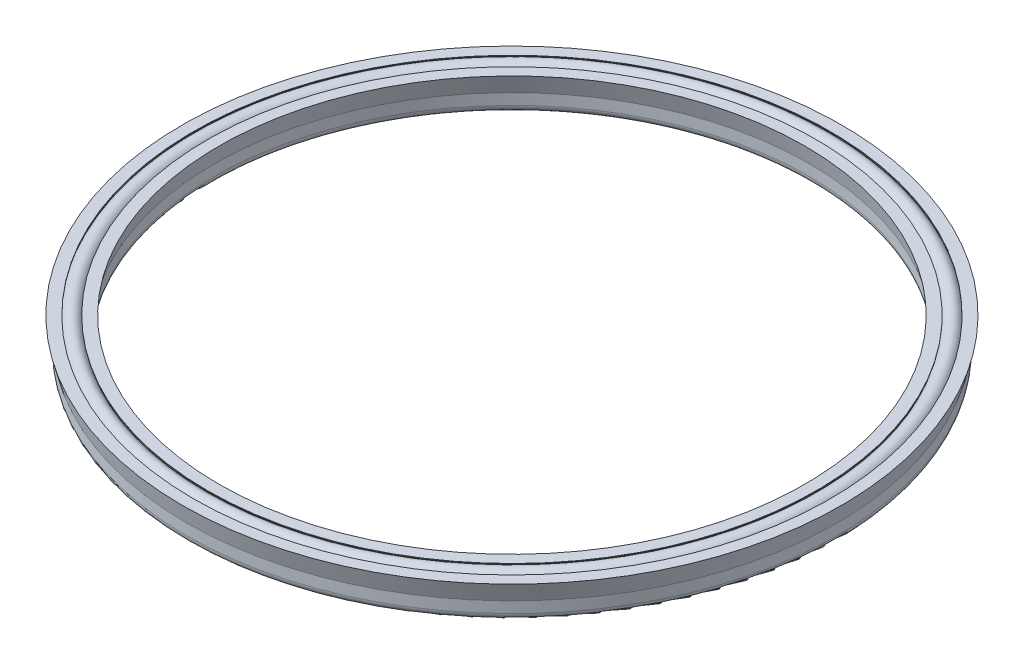
ISO-10303-21;
HEADER;
FILE_DESCRIPTION(('STEP AP214'),'2;1');
FILE_NAME('part.step','',(''),(''),'','','');
FILE_SCHEMA(('AUTOMOTIVE_DESIGN { 1 0 10303 214 1 1 1 1 }'));
ENDSEC;
DATA;
#1=APPLICATION_CONTEXT('core data for automotive mechanical design processes');
#2=APPLICATION_PROTOCOL_DEFINITION('international standard','automotive_design',2000,#1);
#3=PRODUCT_CONTEXT('',#1,'mechanical');
#4=PRODUCT('Part','Part','',(#3));
#5=PRODUCT_RELATED_PRODUCT_CATEGORY('part','',(#4));
#6=PRODUCT_DEFINITION_FORMATION('','',#4);
#7=PRODUCT_DEFINITION_CONTEXT('part definition',#1,'design');
#8=PRODUCT_DEFINITION('design','',#6,#7);
#9=PRODUCT_DEFINITION_SHAPE('','',#8);
#10=(LENGTH_UNIT() NAMED_UNIT(*) SI_UNIT(.MILLI.,.METRE.));
#11=(NAMED_UNIT(*) PLANE_ANGLE_UNIT() SI_UNIT($,.RADIAN.));
#12=(NAMED_UNIT(*) SI_UNIT($,.STERADIAN.) SOLID_ANGLE_UNIT());
#13=UNCERTAINTY_MEASURE_WITH_UNIT(LENGTH_MEASURE(1.E-05),#10,'distance_accuracy_value','');
#14=(GEOMETRIC_REPRESENTATION_CONTEXT(3) GLOBAL_UNCERTAINTY_ASSIGNED_CONTEXT((#13)) GLOBAL_UNIT_ASSIGNED_CONTEXT((#10,
#11,#12)) REPRESENTATION_CONTEXT('',''));
#15=CARTESIAN_POINT('',(0.,0.,0.));
#16=DIRECTION('',(0.,0.,1.));
#17=DIRECTION('',(1.,0.,0.));
#18=AXIS2_PLACEMENT_3D('',#15,#16,#17);
#19=CARTESIAN_POINT('',(0.,-1.13607096486151,0.));
#20=DIRECTION('',(0.,1.,0.));
#21=DIRECTION('',(0.,0.,1.));
#22=AXIS2_PLACEMENT_3D('',#19,#20,#21);
#23=TOROIDAL_SURFACE('',#22,53.9749950745618,1.4684352219848);
#24=CARTESIAN_POINT('',(0.,-1.13607096486151,55.4434302965466));
#25=VERTEX_POINT('',#24);
#26=VERTEX_LOOP('',#25);
#27=FACE_BOUND('',#26,.T.);
#28=ADVANCED_FACE('F41',(#27),#23,.T.);
#29=CLOSED_SHELL('',(#28));
#30=MANIFOLD_SOLID_BREP('B2',#29);
#31=CARTESIAN_POINT('',(0.,0.,0.));
#32=DIRECTION('',(0.,1.,0.));
#33=DIRECTION('',(0.,0.,1.));
#34=AXIS2_PLACEMENT_3D('',#31,#32,#33);
#35=CONICAL_SURFACE('',#34,57.1499901491235,0.252741728912575);
#36=CARTESIAN_POINT('',(0.,-3.07339523217579,0.));
#37=DIRECTION('',(0.,1.,0.));
#38=DIRECTION('',(0.,0.,1.));
#39=AXIS2_PLACEMENT_3D('',#36,#37,#38);
#40=CIRCLE('',#39,56.356241380483);
#41=CARTESIAN_POINT('',(0.,-3.07339523217579,56.356241380483));
#42=VERTEX_POINT('',#41);
#43=EDGE_CURVE('E40',#42,#42,#40,.T.);
#44=ORIENTED_EDGE('',*,*,#43,.T.);
#45=EDGE_LOOP('',(#44));
#46=FACE_BOUND('',#45,.T.);
#47=CARTESIAN_POINT('',(0.,0.,0.));
#48=DIRECTION('',(0.,1.,0.));
#49=DIRECTION('',(0.,0.,1.));
#50=AXIS2_PLACEMENT_3D('',#47,#48,#49);
#51=CIRCLE('',#50,57.1499901491235);
#52=CARTESIAN_POINT('',(0.,0.,57.1499901491235));
#53=VERTEX_POINT('',#52);
#54=EDGE_CURVE('E96',#53,#53,#51,.T.);
#55=ORIENTED_EDGE('',*,*,#54,.F.);
#56=EDGE_LOOP('',(#55));
#57=FACE_BOUND('',#56,.T.);
#58=ADVANCED_FACE('F56',(#46,#57),#35,.T.);
#59=CARTESIAN_POINT('',(0.,0.,0.));
#60=DIRECTION('',(0.,1.,0.));
#61=DIRECTION('',(0.,0.,1.));
#62=AXIS2_PLACEMENT_3D('',#59,#60,#61);
#63=CYLINDRICAL_SURFACE('',#62,56.356241380483);
#64=CARTESIAN_POINT('',(0.,-4.97839227691281,0.));
#65=DIRECTION('',(0.,1.,0.));
#66=DIRECTION('',(0.,0.,1.));
#67=AXIS2_PLACEMENT_3D('',#64,#65,#66);
#68=CIRCLE('',#67,56.356241380483);
#69=CARTESIAN_POINT('',(0.,-4.97839227691281,56.356241380483));
#70=VERTEX_POINT('',#69);
#71=EDGE_CURVE('E62',#70,#70,#68,.T.);
#72=ORIENTED_EDGE('',*,*,#71,.T.);
#73=EDGE_LOOP('',(#72));
#74=FACE_BOUND('',#73,.T.);
#75=ORIENTED_EDGE('',*,*,#43,.F.);
#76=EDGE_LOOP('',(#75));
#77=FACE_BOUND('',#76,.T.);
#78=ADVANCED_FACE('F104',(#74,#77),#63,.T.);
#79=CARTESIAN_POINT('',(0.,-4.97839227691281,0.));
#80=DIRECTION('',(0.,1.,0.));
#81=DIRECTION('',(0.,0.,1.));
#82=AXIS2_PLACEMENT_3D('',#79,#80,#81);
#83=TOROIDAL_SURFACE('',#82,55.0862433506583,1.26999802982469);
#84=CARTESIAN_POINT('',(0.,-6.24839030673749,0.));
#85=DIRECTION('',(0.,1.,0.));
#86=DIRECTION('',(0.,0.,1.));
#87=AXIS2_PLACEMENT_3D('',#84,#85,#86);
#88=CIRCLE('',#87,55.0862433506583);
#89=CARTESIAN_POINT('',(0.,-6.24839030673749,55.0862433506583));
#90=VERTEX_POINT('',#89);
#91=EDGE_CURVE('E66',#90,#90,#88,.T.);
#92=ORIENTED_EDGE('',*,*,#91,.T.);
#93=EDGE_LOOP('',(#92));
#94=FACE_BOUND('',#93,.T.);
#95=ORIENTED_EDGE('',*,*,#71,.F.);
#96=EDGE_LOOP('',(#95));
#97=FACE_BOUND('',#96,.T.);
#98=ADVANCED_FACE('F108',(#94,#97),#83,.T.);
#99=CARTESIAN_POINT('',(-55.0862433506583,-6.24839030673749,0.));
#100=DIRECTION('',(0.,-1.,0.));
#101=DIRECTION('',(0.,0.,-1.));
#102=AXIS2_PLACEMENT_3D('',#99,#100,#101);
#103=PLANE('',#102);
#104=CARTESIAN_POINT('',(0.,-6.24839030673749,0.));
#105=DIRECTION('',(0.,1.,0.));
#106=DIRECTION('',(0.,0.,1.));
#107=AXIS2_PLACEMENT_3D('',#104,#105,#106);
#108=CIRCLE('',#107,52.8637467984651);
#109=CARTESIAN_POINT('',(0.,-6.24839030673749,52.8637467984651));
#110=VERTEX_POINT('',#109);
#111=EDGE_CURVE('E70',#110,#110,#108,.T.);
#112=ORIENTED_EDGE('',*,*,#111,.T.);
#113=EDGE_LOOP('',(#112));
#114=FACE_BOUND('',#113,.T.);
#115=ORIENTED_EDGE('',*,*,#91,.F.);
#116=EDGE_LOOP('',(#115));
#117=FACE_BOUND('',#116,.T.);
#118=ADVANCED_FACE('F112',(#114,#117),#103,.T.);
#119=CARTESIAN_POINT('',(0.,-4.97839227691281,0.));
#120=DIRECTION('',(0.,1.,0.));
#121=DIRECTION('',(0.,0.,1.));
#122=AXIS2_PLACEMENT_3D('',#119,#120,#121);
#123=TOROIDAL_SURFACE('',#122,52.8637467984651,1.26999802982467);
#124=CARTESIAN_POINT('',(0.,-4.97839227691281,0.));
#125=DIRECTION('',(0.,1.,0.));
#126=DIRECTION('',(0.,0.,1.));
#127=AXIS2_PLACEMENT_3D('',#124,#125,#126);
#128=CIRCLE('',#127,51.5937487686405);
#129=CARTESIAN_POINT('',(0.,-4.97839227691281,51.5937487686405));
#130=VERTEX_POINT('',#129);
#131=EDGE_CURVE('E75',#130,#130,#128,.T.);
#132=ORIENTED_EDGE('',*,*,#131,.T.);
#133=EDGE_LOOP('',(#132));
#134=FACE_BOUND('',#133,.T.);
#135=ORIENTED_EDGE('',*,*,#111,.F.);
#136=EDGE_LOOP('',(#135));
#137=FACE_BOUND('',#136,.T.);
#138=ADVANCED_FACE('F119',(#134,#137),#123,.T.);
#139=CARTESIAN_POINT('',(0.,0.,0.));
#140=DIRECTION('',(0.,1.,0.));
#141=DIRECTION('',(0.,0.,1.));
#142=AXIS2_PLACEMENT_3D('',#139,#140,#141);
#143=CYLINDRICAL_SURFACE('',#142,51.5937487686405);
#144=CARTESIAN_POINT('',(0.,-3.07339523217579,0.));
#145=DIRECTION('',(0.,1.,0.));
#146=DIRECTION('',(0.,0.,1.));
#147=AXIS2_PLACEMENT_3D('',#144,#145,#146);
#148=CIRCLE('',#147,51.5937487686405);
#149=CARTESIAN_POINT('',(0.,-3.07339523217579,51.5937487686405));
#150=VERTEX_POINT('',#149);
#151=EDGE_CURVE('E78',#150,#150,#148,.T.);
#152=ORIENTED_EDGE('',*,*,#151,.T.);
#153=EDGE_LOOP('',(#152));
#154=FACE_BOUND('',#153,.T.);
#155=ORIENTED_EDGE('',*,*,#131,.F.);
#156=EDGE_LOOP('',(#155));
#157=FACE_BOUND('',#156,.T.);
#158=ADVANCED_FACE('F123',(#154,#157),#143,.F.);
#159=CARTESIAN_POINT('',(0.,-3.07339523217579,0.));
#160=DIRECTION('',(0.,-1.,0.));
#161=DIRECTION('',(0.,0.,-1.));
#162=AXIS2_PLACEMENT_3D('',#159,#160,#161);
#163=CONICAL_SURFACE('',#162,51.5937487686405,0.252741728912592);
#164=CARTESIAN_POINT('',(0.,0.,0.));
#165=DIRECTION('',(0.,1.,0.));
#166=DIRECTION('',(0.,0.,1.));
#167=AXIS2_PLACEMENT_3D('',#164,#165,#166);
#168=CIRCLE('',#167,50.8);
#169=CARTESIAN_POINT('',(0.,0.,50.8));
#170=VERTEX_POINT('',#169);
#171=EDGE_CURVE('E81',#170,#170,#168,.T.);
#172=ORIENTED_EDGE('',*,*,#171,.T.);
#173=EDGE_LOOP('',(#172));
#174=FACE_BOUND('',#173,.T.);
#175=ORIENTED_EDGE('',*,*,#151,.F.);
#176=EDGE_LOOP('',(#175));
#177=FACE_BOUND('',#176,.T.);
#178=ADVANCED_FACE('F127',(#174,#177),#163,.F.);
#179=CARTESIAN_POINT('',(-52.753843122807,0.,0.));
#180=DIRECTION('',(0.,1.,0.));
#181=DIRECTION('',(0.,0.,1.));
#182=AXIS2_PLACEMENT_3D('',#179,#180,#181);
#183=PLANE('',#182);
#184=CARTESIAN_POINT('',(0.,0.,0.));
#185=DIRECTION('',(0.,1.,0.));
#186=DIRECTION('',(0.,0.,1.));
#187=AXIS2_PLACEMENT_3D('',#184,#185,#186);
#188=CIRCLE('',#187,52.753843122807);
#189=CARTESIAN_POINT('',(0.,0.,52.753843122807));
#190=VERTEX_POINT('',#189);
#191=EDGE_CURVE('E84',#190,#190,#188,.T.);
#192=ORIENTED_EDGE('',*,*,#191,.T.);
#193=EDGE_LOOP('',(#192));
#194=FACE_BOUND('',#193,.T.);
#195=ORIENTED_EDGE('',*,*,#171,.F.);
#196=EDGE_LOOP('',(#195));
#197=FACE_BOUND('',#196,.T.);
#198=ADVANCED_FACE('F131',(#194,#197),#183,.T.);
#199=CARTESIAN_POINT('',(0.,0.,0.));
#200=DIRECTION('',(0.,1.,0.));
#201=DIRECTION('',(0.,0.,1.));
#202=AXIS2_PLACEMENT_3D('',#199,#200,#201);
#203=CYLINDRICAL_SURFACE('',#202,52.7538431228071);
#204=CARTESIAN_POINT('',(0.,-0.121705970592264,0.));
#205=DIRECTION('',(0.,1.,0.));
#206=DIRECTION('',(0.,0.,1.));
#207=AXIS2_PLACEMENT_3D('',#204,#205,#206);
#208=CIRCLE('',#207,52.7538431228072);
#209=CARTESIAN_POINT('',(0.,-0.121705970592264,52.7538431228072));
#210=VERTEX_POINT('',#209);
#211=EDGE_CURVE('E87',#210,#210,#208,.T.);
#212=ORIENTED_EDGE('',*,*,#211,.T.);
#213=EDGE_LOOP('',(#212));
#214=FACE_BOUND('',#213,.T.);
#215=ORIENTED_EDGE('',*,*,#191,.F.);
#216=EDGE_LOOP('',(#215));
#217=FACE_BOUND('',#216,.T.);
#218=ADVANCED_FACE('F135',(#214,#217),#203,.T.);
#219=CARTESIAN_POINT('',(0.,-1.13607096486151,0.));
#220=DIRECTION('',(0.,1.,0.));
#221=DIRECTION('',(0.,0.,1.));
#222=AXIS2_PLACEMENT_3D('',#219,#220,#221);
#223=TOROIDAL_SURFACE('',#222,53.9749950745618,1.58749753728087);
#224=CARTESIAN_POINT('',(0.,-0.121705970592232,0.));
#225=DIRECTION('',(0.,1.,0.));
#226=DIRECTION('',(0.,0.,1.));
#227=AXIS2_PLACEMENT_3D('',#224,#225,#226);
#228=CIRCLE('',#227,55.1961470263162);
#229=CARTESIAN_POINT('',(0.,-0.121705970592232,55.1961470263162));
#230=VERTEX_POINT('',#229);
#231=EDGE_CURVE('E90',#230,#230,#228,.T.);
#232=ORIENTED_EDGE('',*,*,#231,.T.);
#233=EDGE_LOOP('',(#232));
#234=FACE_BOUND('',#233,.T.);
#235=ORIENTED_EDGE('',*,*,#211,.F.);
#236=EDGE_LOOP('',(#235));
#237=FACE_BOUND('',#236,.T.);
#238=ADVANCED_FACE('F139',(#234,#237),#223,.F.);
#239=CARTESIAN_POINT('',(0.,0.,0.));
#240=DIRECTION('',(0.,1.,0.));
#241=DIRECTION('',(0.,0.,1.));
#242=AXIS2_PLACEMENT_3D('',#239,#240,#241);
#243=CYLINDRICAL_SURFACE('',#242,55.1961470263162);
#244=CARTESIAN_POINT('',(0.,0.,0.));
#245=DIRECTION('',(0.,1.,0.));
#246=DIRECTION('',(0.,0.,1.));
#247=AXIS2_PLACEMENT_3D('',#244,#245,#246);
#248=CIRCLE('',#247,55.1961470263161);
#249=CARTESIAN_POINT('',(0.,0.,55.1961470263161));
#250=VERTEX_POINT('',#249);
#251=EDGE_CURVE('E93',#250,#250,#248,.T.);
#252=ORIENTED_EDGE('',*,*,#251,.T.);
#253=EDGE_LOOP('',(#252));
#254=FACE_BOUND('',#253,.T.);
#255=ORIENTED_EDGE('',*,*,#231,.F.);
#256=EDGE_LOOP('',(#255));
#257=FACE_BOUND('',#256,.T.);
#258=ADVANCED_FACE('F143',(#254,#257),#243,.F.);
#259=CARTESIAN_POINT('',(-57.1499901491235,0.,0.));
#260=DIRECTION('',(0.,1.,0.));
#261=DIRECTION('',(0.,0.,1.));
#262=AXIS2_PLACEMENT_3D('',#259,#260,#261);
#263=PLANE('',#262);
#264=ORIENTED_EDGE('',*,*,#54,.T.);
#265=EDGE_LOOP('',(#264));
#266=FACE_BOUND('',#265,.T.);
#267=ORIENTED_EDGE('',*,*,#251,.F.);
#268=EDGE_LOOP('',(#267));
#269=FACE_BOUND('',#268,.T.);
#270=ADVANCED_FACE('F100',(#266,#269),#263,.T.);
#271=CLOSED_SHELL('',(#58,#78,#98,#118,#138,#158,#178,#198,#218,#238,#258,#270));
#272=MANIFOLD_SOLID_BREP('B6',#271);
#273=ADVANCED_BREP_SHAPE_REPRESENTATION('',(#18,#30,#272),#14);
#274=SHAPE_DEFINITION_REPRESENTATION(#9,#273);
ENDSEC;
END-ISO-10303-21;
